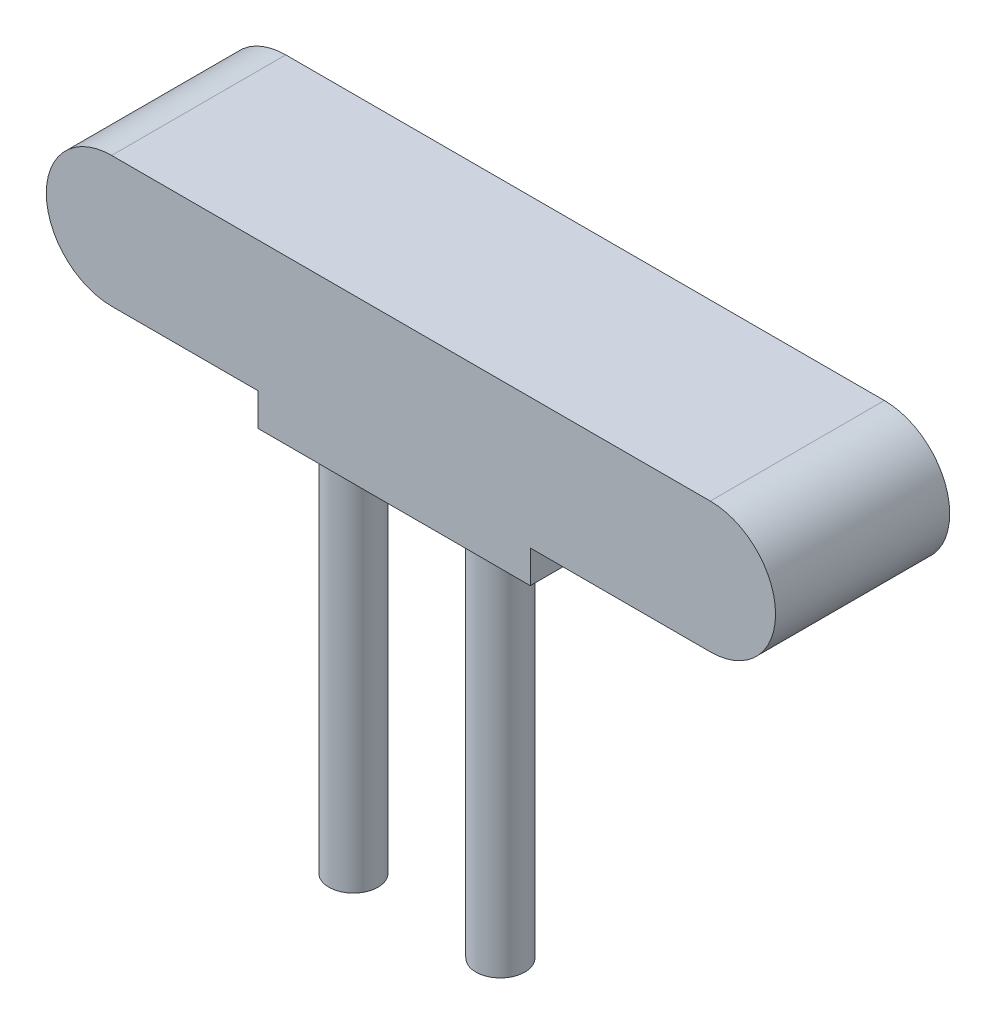
ISO-10303-21;
HEADER;
FILE_DESCRIPTION(('STEP AP214'),'2;1');
FILE_NAME('part.step','',(''),(''),'','','');
FILE_SCHEMA(('AUTOMOTIVE_DESIGN { 1 0 10303 214 1 1 1 1 }'));
ENDSEC;
DATA;
#1=APPLICATION_CONTEXT('core data for automotive mechanical design processes');
#2=APPLICATION_PROTOCOL_DEFINITION('international standard','automotive_design',2000,#1);
#3=PRODUCT_CONTEXT('',#1,'mechanical');
#4=PRODUCT('Part','Part','',(#3));
#5=PRODUCT_RELATED_PRODUCT_CATEGORY('part','',(#4));
#6=PRODUCT_DEFINITION_FORMATION('','',#4);
#7=PRODUCT_DEFINITION_CONTEXT('part definition',#1,'design');
#8=PRODUCT_DEFINITION('design','',#6,#7);
#9=PRODUCT_DEFINITION_SHAPE('','',#8);
#10=(LENGTH_UNIT() NAMED_UNIT(*) SI_UNIT(.MILLI.,.METRE.));
#11=(NAMED_UNIT(*) PLANE_ANGLE_UNIT() SI_UNIT($,.RADIAN.));
#12=(NAMED_UNIT(*) SI_UNIT($,.STERADIAN.) SOLID_ANGLE_UNIT());
#13=UNCERTAINTY_MEASURE_WITH_UNIT(LENGTH_MEASURE(1.E-05),#10,'distance_accuracy_value','');
#14=(GEOMETRIC_REPRESENTATION_CONTEXT(3) GLOBAL_UNCERTAINTY_ASSIGNED_CONTEXT((#13)) GLOBAL_UNIT_ASSIGNED_CONTEXT((#10,
#11,#12)) REPRESENTATION_CONTEXT('',''));
#15=CARTESIAN_POINT('',(0.,0.,0.));
#16=DIRECTION('',(0.,0.,1.));
#17=DIRECTION('',(1.,0.,0.));
#18=AXIS2_PLACEMENT_3D('',#15,#16,#17);
#19=CARTESIAN_POINT('',(0.,7.62,0.));
#20=DIRECTION('',(1.,0.,0.));
#21=DIRECTION('',(0.,0.,-1.));
#22=AXIS2_PLACEMENT_3D('',#19,#20,#21);
#23=PLANE('',#22);
#24=DIRECTION('',(0.,0.,1.));
#25=VECTOR('',#24,1.);
#26=CARTESIAN_POINT('',(0.,0.,0.));
#27=LINE('',#26,#25);
#28=CARTESIAN_POINT('',(0.,0.,-15.24));
#29=VERTEX_POINT('',#28);
#30=CARTESIAN_POINT('',(0.,0.,0.));
#31=VERTEX_POINT('',#30);
#32=EDGE_CURVE('E153',#29,#31,#27,.T.);
#33=ORIENTED_EDGE('',*,*,#32,.T.);
#34=DIRECTION('',(0.,-1.,0.));
#35=VECTOR('',#34,1.);
#36=CARTESIAN_POINT('',(0.,7.62,0.));
#37=LINE('',#36,#35);
#38=CARTESIAN_POINT('',(0.,7.62,0.));
#39=VERTEX_POINT('',#38);
#40=EDGE_CURVE('E11',#39,#31,#37,.T.);
#41=ORIENTED_EDGE('',*,*,#40,.F.);
#42=DIRECTION('',(0.,0.,1.));
#43=VECTOR('',#42,1.);
#44=CARTESIAN_POINT('',(0.,7.62,0.));
#45=LINE('',#44,#43);
#46=CARTESIAN_POINT('',(0.,7.62,-15.24));
#47=VERTEX_POINT('',#46);
#48=EDGE_CURVE('E157',#47,#39,#45,.T.);
#49=ORIENTED_EDGE('',*,*,#48,.F.);
#50=DIRECTION('',(0.,-1.,0.));
#51=VECTOR('',#50,1.);
#52=CARTESIAN_POINT('',(0.,7.62,-15.24));
#53=LINE('',#52,#51);
#54=EDGE_CURVE('E53',#47,#29,#53,.T.);
#55=ORIENTED_EDGE('',*,*,#54,.T.);
#56=EDGE_LOOP('',(#33,#41,#49,#55));
#57=FACE_BOUND('',#56,.T.);
#58=ADVANCED_FACE('F37',(#57),#23,.F.);
#59=CARTESIAN_POINT('',(0.,7.62,0.));
#60=DIRECTION('',(0.,0.,-1.));
#61=DIRECTION('',(-1.,0.,0.));
#62=AXIS2_PLACEMENT_3D('',#59,#60,#61);
#63=PLANE('',#62);
#64=DIRECTION('',(1.,0.,0.));
#65=VECTOR('',#64,1.);
#66=CARTESIAN_POINT('',(0.,0.,0.));
#67=LINE('',#66,#65);
#68=CARTESIAN_POINT('',(63.5,0.,0.));
#69=VERTEX_POINT('',#68);
#70=EDGE_CURVE('E166',#31,#69,#67,.T.);
#71=ORIENTED_EDGE('',*,*,#70,.T.);
#72=DIRECTION('',(0.,-1.,0.));
#73=VECTOR('',#72,1.);
#74=CARTESIAN_POINT('',(63.5,7.62,0.));
#75=LINE('',#74,#73);
#76=CARTESIAN_POINT('',(63.5,7.62,0.));
#77=VERTEX_POINT('',#76);
#78=EDGE_CURVE('E45',#77,#69,#75,.T.);
#79=ORIENTED_EDGE('',*,*,#78,.F.);
#80=DIRECTION('',(1.,0.,0.));
#81=VECTOR('',#80,1.);
#82=CARTESIAN_POINT('',(-34.2099732002428,7.62,0.));
#83=LINE('',#82,#81);
#84=CARTESIAN_POINT('',(105.490026799757,7.62,0.));
#85=VERTEX_POINT('',#84);
#86=EDGE_CURVE('E147',#77,#85,#83,.T.);
#87=ORIENTED_EDGE('',*,*,#86,.T.);
#88=CARTESIAN_POINT('',(105.490026799757,22.86,0.));
#89=DIRECTION('',(0.,0.,1.));
#90=DIRECTION('',(1.,0.,0.));
#91=AXIS2_PLACEMENT_3D('',#88,#89,#90);
#92=CIRCLE('',#91,15.24);
#93=CARTESIAN_POINT('',(105.490026799757,38.1,0.));
#94=VERTEX_POINT('',#93);
#95=EDGE_CURVE('E137',#85,#94,#92,.T.);
#96=ORIENTED_EDGE('',*,*,#95,.T.);
#97=DIRECTION('',(-1.,0.,0.));
#98=VECTOR('',#97,1.);
#99=CARTESIAN_POINT('',(-34.2099732002428,38.1,0.));
#100=LINE('',#99,#98);
#101=CARTESIAN_POINT('',(-34.2099732002428,38.1,0.));
#102=VERTEX_POINT('',#101);
#103=EDGE_CURVE('E134',#94,#102,#100,.T.);
#104=ORIENTED_EDGE('',*,*,#103,.T.);
#105=CARTESIAN_POINT('',(-34.2099732002428,22.86,0.));
#106=DIRECTION('',(0.,0.,1.));
#107=DIRECTION('',(1.,0.,0.));
#108=AXIS2_PLACEMENT_3D('',#105,#106,#107);
#109=CIRCLE('',#108,15.24);
#110=CARTESIAN_POINT('',(-34.2099732002428,7.62,0.));
#111=VERTEX_POINT('',#110);
#112=EDGE_CURVE('E145',#102,#111,#109,.T.);
#113=ORIENTED_EDGE('',*,*,#112,.T.);
#114=EDGE_CURVE('E114',#111,#39,#83,.T.);
#115=ORIENTED_EDGE('',*,*,#114,.T.);
#116=ORIENTED_EDGE('',*,*,#40,.T.);
#117=EDGE_LOOP('',(#71,#79,#87,#96,#104,#113,#115,#116));
#118=FACE_BOUND('',#117,.T.);
#119=ADVANCED_FACE('F188',(#118),#63,.F.);
#120=CARTESIAN_POINT('',(63.5,7.62,0.));
#121=DIRECTION('',(-1.,0.,0.));
#122=DIRECTION('',(0.,0.,1.));
#123=AXIS2_PLACEMENT_3D('',#120,#121,#122);
#124=PLANE('',#123);
#125=DIRECTION('',(0.,0.,-1.));
#126=VECTOR('',#125,1.);
#127=CARTESIAN_POINT('',(63.5,0.,0.));
#128=LINE('',#127,#126);
#129=CARTESIAN_POINT('',(63.5,0.,-15.24));
#130=VERTEX_POINT('',#129);
#131=EDGE_CURVE('E71',#69,#130,#128,.T.);
#132=ORIENTED_EDGE('',*,*,#131,.T.);
#133=DIRECTION('',(0.,-1.,0.));
#134=VECTOR('',#133,1.);
#135=CARTESIAN_POINT('',(63.5,7.62,-15.24));
#136=LINE('',#135,#134);
#137=CARTESIAN_POINT('',(63.5,7.62,-15.24));
#138=VERTEX_POINT('',#137);
#139=EDGE_CURVE('E171',#138,#130,#136,.T.);
#140=ORIENTED_EDGE('',*,*,#139,.F.);
#141=DIRECTION('',(0.,0.,-1.));
#142=VECTOR('',#141,1.);
#143=CARTESIAN_POINT('',(63.5,7.62,0.));
#144=LINE('',#143,#142);
#145=EDGE_CURVE('E159',#77,#138,#144,.T.);
#146=ORIENTED_EDGE('',*,*,#145,.F.);
#147=ORIENTED_EDGE('',*,*,#78,.T.);
#148=EDGE_LOOP('',(#132,#140,#146,#147));
#149=FACE_BOUND('',#148,.T.);
#150=ADVANCED_FACE('F173',(#149),#124,.F.);
#151=CARTESIAN_POINT('',(0.,7.62,-15.24));
#152=DIRECTION('',(0.,0.,1.));
#153=DIRECTION('',(1.,0.,0.));
#154=AXIS2_PLACEMENT_3D('',#151,#152,#153);
#155=PLANE('',#154);
#156=DIRECTION('',(-1.,0.,0.));
#157=VECTOR('',#156,1.);
#158=CARTESIAN_POINT('',(0.,0.,-15.24));
#159=LINE('',#158,#157);
#160=EDGE_CURVE('E74',#130,#29,#159,.T.);
#161=ORIENTED_EDGE('',*,*,#160,.T.);
#162=ORIENTED_EDGE('',*,*,#54,.F.);
#163=DIRECTION('',(-1.,0.,0.));
#164=VECTOR('',#163,1.);
#165=CARTESIAN_POINT('',(0.,7.62,-15.24));
#166=LINE('',#165,#164);
#167=EDGE_CURVE('E162',#138,#47,#166,.T.);
#168=ORIENTED_EDGE('',*,*,#167,.F.);
#169=ORIENTED_EDGE('',*,*,#139,.T.);
#170=EDGE_LOOP('',(#161,#162,#168,#169));
#171=FACE_BOUND('',#170,.T.);
#172=ADVANCED_FACE('F179',(#171),#155,.F.);
#173=CARTESIAN_POINT('',(0.,0.,0.));
#174=DIRECTION('',(0.,-1.,0.));
#175=DIRECTION('',(0.,0.,-1.));
#176=AXIS2_PLACEMENT_3D('',#173,#174,#175);
#177=PLANE('',#176);
#178=CARTESIAN_POINT('',(48.895,0.,-7.62));
#179=DIRECTION('',(0.,-1.,0.));
#180=DIRECTION('',(0.,0.,-1.));
#181=AXIS2_PLACEMENT_3D('',#178,#179,#180);
#182=CIRCLE('',#181,5.715);
#183=CARTESIAN_POINT('',(48.895,0.,-13.335));
#184=VERTEX_POINT('',#183);
#185=EDGE_CURVE('E392',#184,#184,#182,.T.);
#186=ORIENTED_EDGE('',*,*,#185,.F.);
#187=EDGE_LOOP('',(#186));
#188=FACE_BOUND('',#187,.T.);
#189=CARTESIAN_POINT('',(14.605,0.,-7.62));
#190=DIRECTION('',(0.,-1.,0.));
#191=DIRECTION('',(0.,0.,-1.));
#192=AXIS2_PLACEMENT_3D('',#189,#190,#191);
#193=CIRCLE('',#192,5.715);
#194=CARTESIAN_POINT('',(14.605,0.,-13.335));
#195=VERTEX_POINT('',#194);
#196=EDGE_CURVE('E140',#195,#195,#193,.T.);
#197=ORIENTED_EDGE('',*,*,#196,.F.);
#198=EDGE_LOOP('',(#197));
#199=FACE_BOUND('',#198,.T.);
#200=ORIENTED_EDGE('',*,*,#32,.F.);
#201=ORIENTED_EDGE('',*,*,#160,.F.);
#202=ORIENTED_EDGE('',*,*,#131,.F.);
#203=ORIENTED_EDGE('',*,*,#70,.F.);
#204=EDGE_LOOP('',(#200,#201,#202,#203));
#205=FACE_BOUND('',#204,.T.);
#206=ADVANCED_FACE('F178',(#188,#199,#205),#177,.T.);
#207=CARTESIAN_POINT('',(-34.2099732002428,7.62,-40.64));
#208=DIRECTION('',(0.,-1.,0.));
#209=DIRECTION('',(1.,0.,0.));
#210=AXIS2_PLACEMENT_3D('',#207,#208,#209);
#211=PLANE('',#210);
#212=ORIENTED_EDGE('',*,*,#48,.T.);
#213=ORIENTED_EDGE('',*,*,#114,.F.);
#214=DIRECTION('',(0.,0.,1.));
#215=VECTOR('',#214,1.);
#216=CARTESIAN_POINT('',(-34.2099732002428,7.62,-40.64));
#217=LINE('',#216,#215);
#218=CARTESIAN_POINT('',(-34.2099732002428,7.62,-40.64));
#219=VERTEX_POINT('',#218);
#220=EDGE_CURVE('E108',#219,#111,#217,.T.);
#221=ORIENTED_EDGE('',*,*,#220,.F.);
#222=DIRECTION('',(1.,0.,0.));
#223=VECTOR('',#222,1.);
#224=CARTESIAN_POINT('',(-34.2099732002428,7.62,-40.64));
#225=LINE('',#224,#223);
#226=CARTESIAN_POINT('',(105.490026799757,7.62,-40.64));
#227=VERTEX_POINT('',#226);
#228=EDGE_CURVE('E112',#219,#227,#225,.T.);
#229=ORIENTED_EDGE('',*,*,#228,.T.);
#230=DIRECTION('',(0.,0.,1.));
#231=VECTOR('',#230,1.);
#232=CARTESIAN_POINT('',(105.490026799757,7.62,-40.64));
#233=LINE('',#232,#231);
#234=EDGE_CURVE('E119',#227,#85,#233,.T.);
#235=ORIENTED_EDGE('',*,*,#234,.T.);
#236=ORIENTED_EDGE('',*,*,#86,.F.);
#237=ORIENTED_EDGE('',*,*,#145,.T.);
#238=ORIENTED_EDGE('',*,*,#167,.T.);
#239=EDGE_LOOP('',(#212,#213,#221,#229,#235,#236,#237,#238));
#240=FACE_BOUND('',#239,.T.);
#241=ADVANCED_FACE('F110',(#240),#211,.T.);
#242=CARTESIAN_POINT('',(-34.2099732002428,22.86,-40.64));
#243=DIRECTION('',(0.,0.,1.));
#244=DIRECTION('',(1.,0.,0.));
#245=AXIS2_PLACEMENT_3D('',#242,#243,#244);
#246=CYLINDRICAL_SURFACE('',#245,15.24);
#247=ORIENTED_EDGE('',*,*,#112,.F.);
#248=DIRECTION('',(0.,0.,1.));
#249=VECTOR('',#248,1.);
#250=CARTESIAN_POINT('',(-34.2099732002428,38.1,-40.64));
#251=LINE('',#250,#249);
#252=CARTESIAN_POINT('',(-34.2099732002428,38.1,-40.64));
#253=VERTEX_POINT('',#252);
#254=EDGE_CURVE('E133',#253,#102,#251,.T.);
#255=ORIENTED_EDGE('',*,*,#254,.F.);
#256=CARTESIAN_POINT('',(-34.2099732002428,22.86,-40.64));
#257=DIRECTION('',(0.,0.,1.));
#258=DIRECTION('',(1.,0.,0.));
#259=AXIS2_PLACEMENT_3D('',#256,#257,#258);
#260=CIRCLE('',#259,15.24);
#261=EDGE_CURVE('E127',#253,#219,#260,.T.);
#262=ORIENTED_EDGE('',*,*,#261,.T.);
#263=ORIENTED_EDGE('',*,*,#220,.T.);
#264=EDGE_LOOP('',(#247,#255,#262,#263));
#265=FACE_BOUND('',#264,.T.);
#266=ADVANCED_FACE('F132',(#265),#246,.T.);
#267=CARTESIAN_POINT('',(-34.2099732002428,38.1,-40.64));
#268=DIRECTION('',(0.,1.,0.));
#269=DIRECTION('',(0.,0.,1.));
#270=AXIS2_PLACEMENT_3D('',#267,#268,#269);
#271=PLANE('',#270);
#272=ORIENTED_EDGE('',*,*,#103,.F.);
#273=DIRECTION('',(0.,0.,1.));
#274=VECTOR('',#273,1.);
#275=CARTESIAN_POINT('',(105.490026799757,38.1,-40.64));
#276=LINE('',#275,#274);
#277=CARTESIAN_POINT('',(105.490026799757,38.1,-40.64));
#278=VERTEX_POINT('',#277);
#279=EDGE_CURVE('E154',#278,#94,#276,.T.);
#280=ORIENTED_EDGE('',*,*,#279,.F.);
#281=DIRECTION('',(-1.,0.,0.));
#282=VECTOR('',#281,1.);
#283=CARTESIAN_POINT('',(-34.2099732002428,38.1,-40.64));
#284=LINE('',#283,#282);
#285=EDGE_CURVE('E120',#278,#253,#284,.T.);
#286=ORIENTED_EDGE('',*,*,#285,.T.);
#287=ORIENTED_EDGE('',*,*,#254,.T.);
#288=EDGE_LOOP('',(#272,#280,#286,#287));
#289=FACE_BOUND('',#288,.T.);
#290=ADVANCED_FACE('F199',(#289),#271,.T.);
#291=CARTESIAN_POINT('',(105.490026799757,22.86,-40.64));
#292=DIRECTION('',(0.,0.,1.));
#293=DIRECTION('',(1.,0.,0.));
#294=AXIS2_PLACEMENT_3D('',#291,#292,#293);
#295=CYLINDRICAL_SURFACE('',#294,15.24);
#296=ORIENTED_EDGE('',*,*,#95,.F.);
#297=ORIENTED_EDGE('',*,*,#234,.F.);
#298=CARTESIAN_POINT('',(105.490026799757,22.86,-40.64));
#299=DIRECTION('',(0.,0.,1.));
#300=DIRECTION('',(1.,0.,0.));
#301=AXIS2_PLACEMENT_3D('',#298,#299,#300);
#302=CIRCLE('',#301,15.24);
#303=EDGE_CURVE('E130',#227,#278,#302,.T.);
#304=ORIENTED_EDGE('',*,*,#303,.T.);
#305=ORIENTED_EDGE('',*,*,#279,.T.);
#306=EDGE_LOOP('',(#296,#297,#304,#305));
#307=FACE_BOUND('',#306,.T.);
#308=ADVANCED_FACE('F201',(#307),#295,.T.);
#309=CARTESIAN_POINT('',(-34.2099732002428,22.86,-40.64));
#310=DIRECTION('',(0.,0.,1.));
#311=DIRECTION('',(1.,0.,0.));
#312=AXIS2_PLACEMENT_3D('',#309,#310,#311);
#313=PLANE('',#312);
#314=ORIENTED_EDGE('',*,*,#261,.F.);
#315=ORIENTED_EDGE('',*,*,#285,.F.);
#316=ORIENTED_EDGE('',*,*,#303,.F.);
#317=ORIENTED_EDGE('',*,*,#228,.F.);
#318=EDGE_LOOP('',(#314,#315,#316,#317));
#319=FACE_BOUND('',#318,.T.);
#320=ADVANCED_FACE('F125',(#319),#313,.F.);
#321=CARTESIAN_POINT('',(14.605,-86.36,-7.62));
#322=DIRECTION('',(0.,1.,0.));
#323=DIRECTION('',(0.,0.,1.));
#324=AXIS2_PLACEMENT_3D('',#321,#322,#323);
#325=CYLINDRICAL_SURFACE('',#324,5.715);
#326=CARTESIAN_POINT('',(14.605,-86.36,-7.62));
#327=DIRECTION('',(0.,-1.,0.));
#328=DIRECTION('',(0.,0.,-1.));
#329=AXIS2_PLACEMENT_3D('',#326,#327,#328);
#330=CIRCLE('',#329,5.715);
#331=CARTESIAN_POINT('',(14.605,-86.36,-13.335));
#332=VERTEX_POINT('',#331);
#333=EDGE_CURVE('E148',#332,#332,#330,.T.);
#334=ORIENTED_EDGE('',*,*,#333,.F.);
#335=EDGE_LOOP('',(#334));
#336=FACE_BOUND('',#335,.T.);
#337=ORIENTED_EDGE('',*,*,#196,.T.);
#338=EDGE_LOOP('',(#337));
#339=FACE_BOUND('',#338,.T.);
#340=ADVANCED_FACE('F208',(#336,#339),#325,.T.);
#341=CARTESIAN_POINT('',(14.605,-86.36,-7.62));
#342=DIRECTION('',(0.,-1.,0.));
#343=DIRECTION('',(0.,0.,-1.));
#344=AXIS2_PLACEMENT_3D('',#341,#342,#343);
#345=PLANE('',#344);
#346=CARTESIAN_POINT('',(14.605,-86.36,-7.62));
#347=DIRECTION('',(0.,-1.,0.));
#348=DIRECTION('',(0.,0.,-1.));
#349=AXIS2_PLACEMENT_3D('',#346,#347,#348);
#350=CIRCLE('',#349,1.905);
#351=CARTESIAN_POINT('',(14.605,-86.36,-9.525));
#352=VERTEX_POINT('',#351);
#353=EDGE_CURVE('E389',#352,#352,#350,.T.);
#354=ORIENTED_EDGE('',*,*,#353,.F.);
#355=EDGE_LOOP('',(#354));
#356=FACE_BOUND('',#355,.T.);
#357=ORIENTED_EDGE('',*,*,#333,.T.);
#358=EDGE_LOOP('',(#357));
#359=FACE_BOUND('',#358,.T.);
#360=ADVANCED_FACE('F254',(#356,#359),#345,.T.);
#361=CARTESIAN_POINT('',(48.895,-86.36,-7.62));
#362=DIRECTION('',(0.,1.,0.));
#363=DIRECTION('',(0.,0.,1.));
#364=AXIS2_PLACEMENT_3D('',#361,#362,#363);
#365=CYLINDRICAL_SURFACE('',#364,5.715);
#366=CARTESIAN_POINT('',(48.895,-86.36,-7.62));
#367=DIRECTION('',(0.,-1.,0.));
#368=DIRECTION('',(0.,0.,-1.));
#369=AXIS2_PLACEMENT_3D('',#366,#367,#368);
#370=CIRCLE('',#369,5.715);
#371=CARTESIAN_POINT('',(48.895,-86.36,-13.335));
#372=VERTEX_POINT('',#371);
#373=EDGE_CURVE('E388',#372,#372,#370,.T.);
#374=ORIENTED_EDGE('',*,*,#373,.F.);
#375=EDGE_LOOP('',(#374));
#376=FACE_BOUND('',#375,.T.);
#377=ORIENTED_EDGE('',*,*,#185,.T.);
#378=EDGE_LOOP('',(#377));
#379=FACE_BOUND('',#378,.T.);
#380=ADVANCED_FACE('F263',(#376,#379),#365,.T.);
#381=CARTESIAN_POINT('',(48.895,-86.36,-7.62));
#382=DIRECTION('',(0.,-1.,0.));
#383=DIRECTION('',(0.,0.,-1.));
#384=AXIS2_PLACEMENT_3D('',#381,#382,#383);
#385=PLANE('',#384);
#386=CARTESIAN_POINT('',(48.895,-86.36,-7.62));
#387=DIRECTION('',(0.,-1.,0.));
#388=DIRECTION('',(0.,0.,-1.));
#389=AXIS2_PLACEMENT_3D('',#386,#387,#388);
#390=CIRCLE('',#389,1.905);
#391=CARTESIAN_POINT('',(48.895,-86.36,-9.525));
#392=VERTEX_POINT('',#391);
#393=EDGE_CURVE('E395',#392,#392,#390,.T.);
#394=ORIENTED_EDGE('',*,*,#393,.F.);
#395=EDGE_LOOP('',(#394));
#396=FACE_BOUND('',#395,.T.);
#397=ORIENTED_EDGE('',*,*,#373,.T.);
#398=EDGE_LOOP('',(#397));
#399=FACE_BOUND('',#398,.T.);
#400=ADVANCED_FACE('F268',(#396,#399),#385,.T.);
#401=CARTESIAN_POINT('',(48.895,-73.66,-7.62));
#402=DIRECTION('',(0.,-1.,0.));
#403=DIRECTION('',(0.,0.,-1.));
#404=AXIS2_PLACEMENT_3D('',#401,#402,#403);
#405=CYLINDRICAL_SURFACE('',#404,1.905);
#406=CARTESIAN_POINT('',(48.895,-73.66,-7.62));
#407=DIRECTION('',(0.,-1.,0.));
#408=DIRECTION('',(0.,0.,-1.));
#409=AXIS2_PLACEMENT_3D('',#406,#407,#408);
#410=CIRCLE('',#409,1.905);
#411=CARTESIAN_POINT('',(48.895,-73.66,-9.525));
#412=VERTEX_POINT('',#411);
#413=EDGE_CURVE('E400',#412,#412,#410,.T.);
#414=ORIENTED_EDGE('',*,*,#413,.F.);
#415=EDGE_LOOP('',(#414));
#416=FACE_BOUND('',#415,.T.);
#417=ORIENTED_EDGE('',*,*,#393,.T.);
#418=EDGE_LOOP('',(#417));
#419=FACE_BOUND('',#418,.T.);
#420=ADVANCED_FACE('F287',(#416,#419),#405,.F.);
#421=CARTESIAN_POINT('',(48.895,-73.66,-7.62));
#422=DIRECTION('',(0.,-1.,0.));
#423=DIRECTION('',(0.,0.,-1.));
#424=AXIS2_PLACEMENT_3D('',#421,#422,#423);
#425=PLANE('',#424);
#426=ORIENTED_EDGE('',*,*,#413,.T.);
#427=EDGE_LOOP('',(#426));
#428=FACE_BOUND('',#427,.T.);
#429=ADVANCED_FACE('F298',(#428),#425,.T.);
#430=CARTESIAN_POINT('',(14.605,-73.66,-7.62));
#431=DIRECTION('',(0.,-1.,0.));
#432=DIRECTION('',(0.,0.,-1.));
#433=AXIS2_PLACEMENT_3D('',#430,#431,#432);
#434=CYLINDRICAL_SURFACE('',#433,1.905);
#435=CARTESIAN_POINT('',(14.605,-73.66,-7.62));
#436=DIRECTION('',(0.,-1.,0.));
#437=DIRECTION('',(0.,0.,-1.));
#438=AXIS2_PLACEMENT_3D('',#435,#436,#437);
#439=CIRCLE('',#438,1.905);
#440=CARTESIAN_POINT('',(14.605,-73.66,-9.525));
#441=VERTEX_POINT('',#440);
#442=EDGE_CURVE('E387',#441,#441,#439,.T.);
#443=ORIENTED_EDGE('',*,*,#442,.F.);
#444=EDGE_LOOP('',(#443));
#445=FACE_BOUND('',#444,.T.);
#446=ORIENTED_EDGE('',*,*,#353,.T.);
#447=EDGE_LOOP('',(#446));
#448=FACE_BOUND('',#447,.T.);
#449=ADVANCED_FACE('F309',(#445,#448),#434,.F.);
#450=CARTESIAN_POINT('',(14.605,-73.66,-7.62));
#451=DIRECTION('',(0.,-1.,0.));
#452=DIRECTION('',(0.,0.,-1.));
#453=AXIS2_PLACEMENT_3D('',#450,#451,#452);
#454=PLANE('',#453);
#455=ORIENTED_EDGE('',*,*,#442,.T.);
#456=EDGE_LOOP('',(#455));
#457=FACE_BOUND('',#456,.T.);
#458=ADVANCED_FACE('F320',(#457),#454,.T.);
#459=CLOSED_SHELL('',(#58,#119,#150,#172,#206,#241,#266,#290,#308,#320,#340,#360,#380,#400,#420,
#429,#449,#458));
#460=MANIFOLD_SOLID_BREP('B2',#459);
#461=ADVANCED_BREP_SHAPE_REPRESENTATION('',(#18,#460),#14);
#462=SHAPE_DEFINITION_REPRESENTATION(#9,#461);
ENDSEC;
END-ISO-10303-21;
